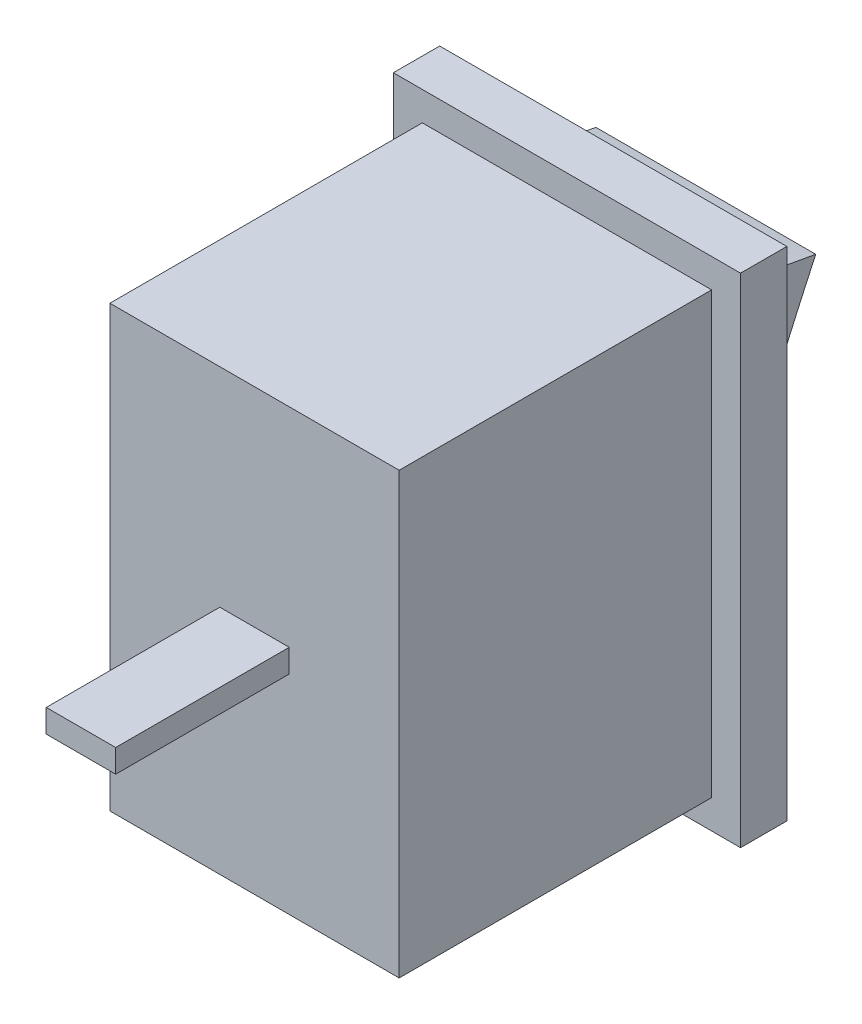
ISO-10303-21;
HEADER;
FILE_DESCRIPTION(('STEP AP214'),'2;1');
FILE_NAME('part.step','',(''),(''),'','','');
FILE_SCHEMA(('AUTOMOTIVE_DESIGN { 1 0 10303 214 1 1 1 1 }'));
ENDSEC;
DATA;
#1=APPLICATION_CONTEXT('core data for automotive mechanical design processes');
#2=APPLICATION_PROTOCOL_DEFINITION('international standard','automotive_design',2000,#1);
#3=PRODUCT_CONTEXT('',#1,'mechanical');
#4=PRODUCT('Part','Part','',(#3));
#5=PRODUCT_RELATED_PRODUCT_CATEGORY('part','',(#4));
#6=PRODUCT_DEFINITION_FORMATION('','',#4);
#7=PRODUCT_DEFINITION_CONTEXT('part definition',#1,'design');
#8=PRODUCT_DEFINITION('design','',#6,#7);
#9=PRODUCT_DEFINITION_SHAPE('','',#8);
#10=(LENGTH_UNIT() NAMED_UNIT(*) SI_UNIT(.MILLI.,.METRE.));
#11=(NAMED_UNIT(*) PLANE_ANGLE_UNIT() SI_UNIT($,.RADIAN.));
#12=(NAMED_UNIT(*) SI_UNIT($,.STERADIAN.) SOLID_ANGLE_UNIT());
#13=UNCERTAINTY_MEASURE_WITH_UNIT(LENGTH_MEASURE(1.E-05),#10,'distance_accuracy_value','');
#14=(GEOMETRIC_REPRESENTATION_CONTEXT(3) GLOBAL_UNCERTAINTY_ASSIGNED_CONTEXT((#13)) GLOBAL_UNIT_ASSIGNED_CONTEXT((#10,
#11,#12)) REPRESENTATION_CONTEXT('',''));
#15=CARTESIAN_POINT('',(0.,0.,0.));
#16=DIRECTION('',(0.,0.,1.));
#17=DIRECTION('',(1.,0.,0.));
#18=AXIS2_PLACEMENT_3D('',#15,#16,#17);
#19=CARTESIAN_POINT('',(-6.25,-9.5,15.5));
#20=DIRECTION('',(0.,0.,1.));
#21=DIRECTION('',(1.,0.,0.));
#22=AXIS2_PLACEMENT_3D('',#19,#20,#21);
#23=PLANE('',#22);
#24=DIRECTION('',(0.,-1.,0.));
#25=VECTOR('',#24,1.);
#26=CARTESIAN_POINT('',(-6.25,-9.5,15.5));
#27=LINE('',#26,#25);
#28=CARTESIAN_POINT('',(-6.25,9.5,15.5));
#29=VERTEX_POINT('',#28);
#30=CARTESIAN_POINT('',(-6.25,-9.5,15.5));
#31=VERTEX_POINT('',#30);
#32=EDGE_CURVE('E304',#29,#31,#27,.T.);
#33=ORIENTED_EDGE('',*,*,#32,.T.);
#34=DIRECTION('',(1.,0.,0.));
#35=VECTOR('',#34,1.);
#36=CARTESIAN_POINT('',(6.25000000000001,-9.5,15.5));
#37=LINE('',#36,#35);
#38=CARTESIAN_POINT('',(6.25000000000001,-9.5,15.5));
#39=VERTEX_POINT('',#38);
#40=EDGE_CURVE('E317',#31,#39,#37,.T.);
#41=ORIENTED_EDGE('',*,*,#40,.T.);
#42=DIRECTION('',(0.,1.,0.));
#43=VECTOR('',#42,1.);
#44=CARTESIAN_POINT('',(6.25,9.5,15.5));
#45=LINE('',#44,#43);
#46=CARTESIAN_POINT('',(6.25,9.5,15.5));
#47=VERTEX_POINT('',#46);
#48=EDGE_CURVE('E315',#39,#47,#45,.T.);
#49=ORIENTED_EDGE('',*,*,#48,.T.);
#50=DIRECTION('',(-1.,0.,0.));
#51=VECTOR('',#50,1.);
#52=CARTESIAN_POINT('',(-6.25,9.5,15.5));
#53=LINE('',#52,#51);
#54=EDGE_CURVE('E301',#47,#29,#53,.T.);
#55=ORIENTED_EDGE('',*,*,#54,.T.);
#56=EDGE_LOOP('',(#33,#41,#49,#55));
#57=FACE_BOUND('',#56,.T.);
#58=DIRECTION('',(1.,0.,0.));
#59=VECTOR('',#58,1.);
#60=CARTESIAN_POINT('',(-1.5,-0.5,15.5));
#61=LINE('',#60,#59);
#62=CARTESIAN_POINT('',(-1.5,-0.5,15.5));
#63=VERTEX_POINT('',#62);
#64=CARTESIAN_POINT('',(1.5,-0.5,15.5));
#65=VERTEX_POINT('',#64);
#66=EDGE_CURVE('E384',#63,#65,#61,.T.);
#67=ORIENTED_EDGE('',*,*,#66,.F.);
#68=DIRECTION('',(0.,-1.,0.));
#69=VECTOR('',#68,1.);
#70=CARTESIAN_POINT('',(-1.5,0.5,15.5));
#71=LINE('',#70,#69);
#72=CARTESIAN_POINT('',(-1.5,0.5,15.5));
#73=VERTEX_POINT('',#72);
#74=EDGE_CURVE('E170',#73,#63,#71,.T.);
#75=ORIENTED_EDGE('',*,*,#74,.F.);
#76=DIRECTION('',(-1.,0.,0.));
#77=VECTOR('',#76,1.);
#78=CARTESIAN_POINT('',(-1.5,0.5,15.5));
#79=LINE('',#78,#77);
#80=CARTESIAN_POINT('',(1.5,0.500000000000001,15.5));
#81=VERTEX_POINT('',#80);
#82=EDGE_CURVE('E166',#81,#73,#79,.T.);
#83=ORIENTED_EDGE('',*,*,#82,.F.);
#84=DIRECTION('',(0.,1.,0.));
#85=VECTOR('',#84,1.);
#86=CARTESIAN_POINT('',(1.5,0.5,15.5));
#87=LINE('',#86,#85);
#88=EDGE_CURVE('E386',#65,#81,#87,.T.);
#89=ORIENTED_EDGE('',*,*,#88,.F.);
#90=EDGE_LOOP('',(#67,#75,#83,#89));
#91=FACE_BOUND('',#90,.T.);
#92=ADVANCED_FACE('F33',(#57,#91),#23,.T.);
#93=CARTESIAN_POINT('',(4.75,7.5,-4.));
#94=DIRECTION('',(-1.,0.,0.));
#95=DIRECTION('',(0.,-1.,0.));
#96=AXIS2_PLACEMENT_3D('',#93,#94,#95);
#97=PLANE('',#96);
#98=CARTESIAN_POINT('',(4.75,-7.5,-0.355698538172021));
#99=CARTESIAN_POINT('',(4.75,-7.20358473254136,-0.354349181532763));
#100=CARTESIAN_POINT('',(4.75,-4.68700606925858,-0.342893084292468));
#101=CARTESIAN_POINT('',(4.75,0.423075598671808,-0.90591646987989));
#102=CARTESIAN_POINT('',(4.75,4.76511014941746,-2.92374207641146));
#103=CARTESIAN_POINT('',(4.75,7.08104323828726,-4.));
#104=B_SPLINE_CURVE_WITH_KNOTS('',3,(#98,#99,#100,#101,#102,#103),.UNSPECIFIED.,.F.,.F.,(4,1,1,
4),(0.,0.0586457613073711,0.497905093969898,1.),.UNSPECIFIED.);
#105=CARTESIAN_POINT('',(4.75,7.08104323828726,-4.));
#106=VERTEX_POINT('',#105);
#107=CARTESIAN_POINT('',(4.74999999999999,-7.5,-0.355698538172021));
#108=VERTEX_POINT('',#107);
#109=EDGE_CURVE('E336',#106,#108,#104,.F.);
#110=ORIENTED_EDGE('',*,*,#109,.F.);
#111=CARTESIAN_POINT('',(4.75,7.08104323828726,-4.));
#112=CARTESIAN_POINT('',(4.75,7.19501669015073,-3.41831864187691));
#113=CARTESIAN_POINT('',(4.75,7.45366483827933,-2.09826731747113));
#114=CARTESIAN_POINT('',(4.75,7.48337925673809,-0.75266301192165));
#115=CARTESIAN_POINT('',(4.75,7.5,0.));
#116=B_SPLINE_CURVE_WITH_KNOTS('',3,(#111,#112,#113,#114,#115),.UNSPECIFIED.,.F.,.F.,(4,1,4),
(0.,0.440650562117295,1.),.UNSPECIFIED.);
#117=CARTESIAN_POINT('',(4.75,7.5,0.));
#118=VERTEX_POINT('',#117);
#119=EDGE_CURVE('E349',#118,#106,#116,.F.);
#120=ORIENTED_EDGE('',*,*,#119,.F.);
#121=DIRECTION('',(0.,-1.,0.));
#122=VECTOR('',#121,1.);
#123=CARTESIAN_POINT('',(4.75,7.5,0.));
#124=LINE('',#123,#122);
#125=CARTESIAN_POINT('',(4.74999999999999,-7.5,0.));
#126=VERTEX_POINT('',#125);
#127=EDGE_CURVE('E333',#118,#126,#124,.T.);
#128=ORIENTED_EDGE('',*,*,#127,.T.);
#129=DIRECTION('',(0.,0.,1.));
#130=VECTOR('',#129,1.);
#131=CARTESIAN_POINT('',(4.74999999999999,-7.5,-4.));
#132=LINE('',#131,#130);
#133=EDGE_CURVE('E313',#108,#126,#132,.T.);
#134=ORIENTED_EDGE('',*,*,#133,.F.);
#135=EDGE_LOOP('',(#110,#120,#128,#134));
#136=FACE_BOUND('',#135,.T.);
#137=ADVANCED_FACE('F210',(#136),#97,.F.);
#138=CARTESIAN_POINT('',(4.74999999999999,-7.5,-4.));
#139=DIRECTION('',(0.,1.,0.));
#140=DIRECTION('',(-1.,0.,0.));
#141=AXIS2_PLACEMENT_3D('',#138,#139,#140);
#142=PLANE('',#141);
#143=DIRECTION('',(1.,0.,0.));
#144=VECTOR('',#143,1.);
#145=CARTESIAN_POINT('',(-49.0282731317614,-7.49999999999999,-0.355698538172021));
#146=LINE('',#145,#144);
#147=CARTESIAN_POINT('',(-4.75,-7.5,-0.355698538172021));
#148=VERTEX_POINT('',#147);
#149=EDGE_CURVE('E56',#148,#108,#146,.T.);
#150=ORIENTED_EDGE('',*,*,#149,.T.);
#151=ORIENTED_EDGE('',*,*,#133,.T.);
#152=DIRECTION('',(-1.,0.,0.));
#153=VECTOR('',#152,1.);
#154=CARTESIAN_POINT('',(4.74999999999999,-7.5,0.));
#155=LINE('',#154,#153);
#156=CARTESIAN_POINT('',(-4.75,-7.5,0.));
#157=VERTEX_POINT('',#156);
#158=EDGE_CURVE('E330',#126,#157,#155,.T.);
#159=ORIENTED_EDGE('',*,*,#158,.T.);
#160=DIRECTION('',(0.,0.,1.));
#161=VECTOR('',#160,1.);
#162=CARTESIAN_POINT('',(-4.75,-7.5,-4.));
#163=LINE('',#162,#161);
#164=EDGE_CURVE('E322',#148,#157,#163,.T.);
#165=ORIENTED_EDGE('',*,*,#164,.F.);
#166=EDGE_LOOP('',(#150,#151,#159,#165));
#167=FACE_BOUND('',#166,.T.);
#168=ADVANCED_FACE('F206',(#167),#142,.F.);
#169=CARTESIAN_POINT('',(-4.75,7.5,-4.));
#170=DIRECTION('',(1.,0.,0.));
#171=DIRECTION('',(0.,1.,0.));
#172=AXIS2_PLACEMENT_3D('',#169,#170,#171);
#173=PLANE('',#172);
#174=CARTESIAN_POINT('',(-4.75,-7.5,-0.355698538172021));
#175=CARTESIAN_POINT('',(-4.75,-7.20358473254136,-0.354349181532763));
#176=CARTESIAN_POINT('',(-4.75,-4.68700606925858,-0.342893084292468));
#177=CARTESIAN_POINT('',(-4.75,0.423075598671809,-0.90591646987989));
#178=CARTESIAN_POINT('',(-4.75,4.76511014941746,-2.92374207641146));
#179=CARTESIAN_POINT('',(-4.75,7.08104323828726,-4.));
#180=B_SPLINE_CURVE_WITH_KNOTS('',3,(#174,#175,#176,#177,#178,#179),.UNSPECIFIED.,.F.,.F.,(4,1,
1,4),(0.,0.0586457613073711,0.497905093969898,1.),.UNSPECIFIED.);
#181=CARTESIAN_POINT('',(-4.75,7.08104323828726,-4.));
#182=VERTEX_POINT('',#181);
#183=EDGE_CURVE('E341',#148,#182,#180,.T.);
#184=ORIENTED_EDGE('',*,*,#183,.F.);
#185=ORIENTED_EDGE('',*,*,#164,.T.);
#186=DIRECTION('',(0.,1.,0.));
#187=VECTOR('',#186,1.);
#188=CARTESIAN_POINT('',(-4.75,7.5,0.));
#189=LINE('',#188,#187);
#190=CARTESIAN_POINT('',(-4.75,7.5,0.));
#191=VERTEX_POINT('',#190);
#192=EDGE_CURVE('E327',#157,#191,#189,.T.);
#193=ORIENTED_EDGE('',*,*,#192,.T.);
#194=CARTESIAN_POINT('',(-4.75,7.08104323828726,-4.));
#195=CARTESIAN_POINT('',(-4.75,7.19501669015073,-3.41831864187691));
#196=CARTESIAN_POINT('',(-4.75,7.45366483827933,-2.09826731747113));
#197=CARTESIAN_POINT('',(-4.75,7.48337925673809,-0.75266301192165));
#198=CARTESIAN_POINT('',(-4.75,7.5,0.));
#199=B_SPLINE_CURVE_WITH_KNOTS('',3,(#194,#195,#196,#197,#198),.UNSPECIFIED.,.F.,.F.,(4,1,4),
(0.,0.440650562117295,1.),.UNSPECIFIED.);
#200=EDGE_CURVE('E357',#182,#191,#199,.T.);
#201=ORIENTED_EDGE('',*,*,#200,.F.);
#202=EDGE_LOOP('',(#184,#185,#193,#201));
#203=FACE_BOUND('',#202,.T.);
#204=ADVANCED_FACE('F202',(#203),#173,.F.);
#205=CARTESIAN_POINT('',(-7.5,-10.75,0.));
#206=DIRECTION('',(0.,0.,1.));
#207=DIRECTION('',(1.,0.,0.));
#208=AXIS2_PLACEMENT_3D('',#205,#206,#207);
#209=PLANE('',#208);
#210=ORIENTED_EDGE('',*,*,#127,.F.);
#211=DIRECTION('',(1.,0.,0.));
#212=VECTOR('',#211,1.);
#213=CARTESIAN_POINT('',(4.75,7.5,0.));
#214=LINE('',#213,#212);
#215=EDGE_CURVE('E324',#191,#118,#214,.T.);
#216=ORIENTED_EDGE('',*,*,#215,.F.);
#217=ORIENTED_EDGE('',*,*,#192,.F.);
#218=ORIENTED_EDGE('',*,*,#158,.F.);
#219=EDGE_LOOP('',(#210,#216,#217,#218));
#220=FACE_BOUND('',#219,.T.);
#221=DIRECTION('',(-1.,0.,0.));
#222=VECTOR('',#221,1.);
#223=CARTESIAN_POINT('',(-7.5,10.75,0.));
#224=LINE('',#223,#222);
#225=CARTESIAN_POINT('',(7.5,10.75,0.));
#226=VERTEX_POINT('',#225);
#227=CARTESIAN_POINT('',(-7.5,10.75,0.));
#228=VERTEX_POINT('',#227);
#229=EDGE_CURVE('E270',#226,#228,#224,.T.);
#230=ORIENTED_EDGE('',*,*,#229,.F.);
#231=DIRECTION('',(0.,1.,0.));
#232=VECTOR('',#231,1.);
#233=CARTESIAN_POINT('',(7.5,10.75,0.));
#234=LINE('',#233,#232);
#235=CARTESIAN_POINT('',(7.50000000000002,-10.75,0.));
#236=VERTEX_POINT('',#235);
#237=EDGE_CURVE('E262',#236,#226,#234,.T.);
#238=ORIENTED_EDGE('',*,*,#237,.F.);
#239=DIRECTION('',(1.,0.,0.));
#240=VECTOR('',#239,1.);
#241=CARTESIAN_POINT('',(7.50000000000002,-10.75,0.));
#242=LINE('',#241,#240);
#243=CARTESIAN_POINT('',(-7.5,-10.75,0.));
#244=VERTEX_POINT('',#243);
#245=EDGE_CURVE('E255',#244,#236,#242,.T.);
#246=ORIENTED_EDGE('',*,*,#245,.F.);
#247=DIRECTION('',(0.,-1.,0.));
#248=VECTOR('',#247,1.);
#249=CARTESIAN_POINT('',(-7.5,-10.75,0.));
#250=LINE('',#249,#248);
#251=EDGE_CURVE('E263',#228,#244,#250,.T.);
#252=ORIENTED_EDGE('',*,*,#251,.F.);
#253=EDGE_LOOP('',(#230,#238,#246,#252));
#254=FACE_BOUND('',#253,.T.);
#255=ADVANCED_FACE('F205',(#220,#254),#209,.F.);
#256=CARTESIAN_POINT('',(-7.5,-10.75,2.));
#257=DIRECTION('',(0.,0.,1.));
#258=DIRECTION('',(1.,0.,0.));
#259=AXIS2_PLACEMENT_3D('',#256,#257,#258);
#260=PLANE('',#259);
#261=DIRECTION('',(0.,-1.,0.));
#262=VECTOR('',#261,1.);
#263=CARTESIAN_POINT('',(-7.5,-10.75,2.));
#264=LINE('',#263,#262);
#265=CARTESIAN_POINT('',(-7.5,10.75,2.));
#266=VERTEX_POINT('',#265);
#267=CARTESIAN_POINT('',(-7.5,-10.75,2.));
#268=VERTEX_POINT('',#267);
#269=EDGE_CURVE('E272',#266,#268,#264,.T.);
#270=ORIENTED_EDGE('',*,*,#269,.T.);
#271=DIRECTION('',(1.,0.,0.));
#272=VECTOR('',#271,1.);
#273=CARTESIAN_POINT('',(7.50000000000002,-10.75,2.));
#274=LINE('',#273,#272);
#275=CARTESIAN_POINT('',(7.50000000000002,-10.75,2.));
#276=VERTEX_POINT('',#275);
#277=EDGE_CURVE('E278',#268,#276,#274,.T.);
#278=ORIENTED_EDGE('',*,*,#277,.T.);
#279=DIRECTION('',(0.,1.,0.));
#280=VECTOR('',#279,1.);
#281=CARTESIAN_POINT('',(7.5,10.75,2.));
#282=LINE('',#281,#280);
#283=CARTESIAN_POINT('',(7.5,10.75,2.));
#284=VERTEX_POINT('',#283);
#285=EDGE_CURVE('E267',#276,#284,#282,.T.);
#286=ORIENTED_EDGE('',*,*,#285,.T.);
#287=DIRECTION('',(-1.,0.,0.));
#288=VECTOR('',#287,1.);
#289=CARTESIAN_POINT('',(-7.5,10.75,2.));
#290=LINE('',#289,#288);
#291=EDGE_CURVE('E281',#284,#266,#290,.T.);
#292=ORIENTED_EDGE('',*,*,#291,.T.);
#293=EDGE_LOOP('',(#270,#278,#286,#292));
#294=FACE_BOUND('',#293,.T.);
#295=DIRECTION('',(1.,0.,0.));
#296=VECTOR('',#295,1.);
#297=CARTESIAN_POINT('',(6.25000000000001,-9.5,2.));
#298=LINE('',#297,#296);
#299=CARTESIAN_POINT('',(-6.25,-9.5,2.));
#300=VERTEX_POINT('',#299);
#301=CARTESIAN_POINT('',(6.25000000000001,-9.5,2.));
#302=VERTEX_POINT('',#301);
#303=EDGE_CURVE('E308',#300,#302,#298,.T.);
#304=ORIENTED_EDGE('',*,*,#303,.F.);
#305=DIRECTION('',(0.,-1.,0.));
#306=VECTOR('',#305,1.);
#307=CARTESIAN_POINT('',(-6.25,-9.5,2.));
#308=LINE('',#307,#306);
#309=CARTESIAN_POINT('',(-6.25,9.5,2.));
#310=VERTEX_POINT('',#309);
#311=EDGE_CURVE('E310',#310,#300,#308,.T.);
#312=ORIENTED_EDGE('',*,*,#311,.F.);
#313=DIRECTION('',(-1.,0.,0.));
#314=VECTOR('',#313,1.);
#315=CARTESIAN_POINT('',(-6.25,9.5,2.));
#316=LINE('',#315,#314);
#317=CARTESIAN_POINT('',(6.25,9.5,2.));
#318=VERTEX_POINT('',#317);
#319=EDGE_CURVE('E302',#318,#310,#316,.T.);
#320=ORIENTED_EDGE('',*,*,#319,.F.);
#321=DIRECTION('',(0.,1.,0.));
#322=VECTOR('',#321,1.);
#323=CARTESIAN_POINT('',(6.25,9.5,2.));
#324=LINE('',#323,#322);
#325=EDGE_CURVE('E305',#302,#318,#324,.T.);
#326=ORIENTED_EDGE('',*,*,#325,.F.);
#327=EDGE_LOOP('',(#304,#312,#320,#326));
#328=FACE_BOUND('',#327,.T.);
#329=ADVANCED_FACE('F235',(#294,#328),#260,.T.);
#330=CARTESIAN_POINT('',(-7.5,-10.75,2.));
#331=DIRECTION('',(1.,0.,0.));
#332=DIRECTION('',(0.,1.,0.));
#333=AXIS2_PLACEMENT_3D('',#330,#331,#332);
#334=PLANE('',#333);
#335=ORIENTED_EDGE('',*,*,#251,.T.);
#336=DIRECTION('',(0.,0.,-1.));
#337=VECTOR('',#336,1.);
#338=CARTESIAN_POINT('',(-7.5,-10.75,2.));
#339=LINE('',#338,#337);
#340=EDGE_CURVE('E11',#268,#244,#339,.T.);
#341=ORIENTED_EDGE('',*,*,#340,.F.);
#342=ORIENTED_EDGE('',*,*,#269,.F.);
#343=DIRECTION('',(0.,0.,-1.));
#344=VECTOR('',#343,1.);
#345=CARTESIAN_POINT('',(-7.5,10.75,2.));
#346=LINE('',#345,#344);
#347=EDGE_CURVE('E283',#266,#228,#346,.T.);
#348=ORIENTED_EDGE('',*,*,#347,.T.);
#349=EDGE_LOOP('',(#335,#341,#342,#348));
#350=FACE_BOUND('',#349,.T.);
#351=ADVANCED_FACE('F35',(#350),#334,.F.);
#352=CARTESIAN_POINT('',(7.50000000000002,-10.75,2.));
#353=DIRECTION('',(0.,1.,0.));
#354=DIRECTION('',(-1.,0.,0.));
#355=AXIS2_PLACEMENT_3D('',#352,#353,#354);
#356=PLANE('',#355);
#357=ORIENTED_EDGE('',*,*,#245,.T.);
#358=DIRECTION('',(0.,0.,-1.));
#359=VECTOR('',#358,1.);
#360=CARTESIAN_POINT('',(7.50000000000002,-10.75,2.));
#361=LINE('',#360,#359);
#362=EDGE_CURVE('E41',#276,#236,#361,.T.);
#363=ORIENTED_EDGE('',*,*,#362,.F.);
#364=ORIENTED_EDGE('',*,*,#277,.F.);
#365=ORIENTED_EDGE('',*,*,#340,.T.);
#366=EDGE_LOOP('',(#357,#363,#364,#365));
#367=FACE_BOUND('',#366,.T.);
#368=ADVANCED_FACE('F245',(#367),#356,.F.);
#369=CARTESIAN_POINT('',(7.5,10.75,2.));
#370=DIRECTION('',(-1.,0.,0.));
#371=DIRECTION('',(0.,-1.,0.));
#372=AXIS2_PLACEMENT_3D('',#369,#370,#371);
#373=PLANE('',#372);
#374=ORIENTED_EDGE('',*,*,#237,.T.);
#375=DIRECTION('',(0.,0.,-1.));
#376=VECTOR('',#375,1.);
#377=CARTESIAN_POINT('',(7.5,10.75,2.));
#378=LINE('',#377,#376);
#379=EDGE_CURVE('E268',#284,#226,#378,.T.);
#380=ORIENTED_EDGE('',*,*,#379,.F.);
#381=ORIENTED_EDGE('',*,*,#285,.F.);
#382=ORIENTED_EDGE('',*,*,#362,.T.);
#383=EDGE_LOOP('',(#374,#380,#381,#382));
#384=FACE_BOUND('',#383,.T.);
#385=ADVANCED_FACE('F242',(#384),#373,.F.);
#386=CARTESIAN_POINT('',(-7.5,10.75,2.));
#387=DIRECTION('',(0.,-1.,0.));
#388=DIRECTION('',(1.,0.,0.));
#389=AXIS2_PLACEMENT_3D('',#386,#387,#388);
#390=PLANE('',#389);
#391=ORIENTED_EDGE('',*,*,#229,.T.);
#392=ORIENTED_EDGE('',*,*,#347,.F.);
#393=ORIENTED_EDGE('',*,*,#291,.F.);
#394=ORIENTED_EDGE('',*,*,#379,.T.);
#395=EDGE_LOOP('',(#391,#392,#393,#394));
#396=FACE_BOUND('',#395,.T.);
#397=ADVANCED_FACE('F231',(#396),#390,.F.);
#398=CARTESIAN_POINT('',(-6.25,-9.5,15.5));
#399=DIRECTION('',(1.,0.,0.));
#400=DIRECTION('',(0.,1.,0.));
#401=AXIS2_PLACEMENT_3D('',#398,#399,#400);
#402=PLANE('',#401);
#403=ORIENTED_EDGE('',*,*,#311,.T.);
#404=DIRECTION('',(0.,0.,-1.));
#405=VECTOR('',#404,1.);
#406=CARTESIAN_POINT('',(-6.25,-9.5,15.5));
#407=LINE('',#406,#405);
#408=EDGE_CURVE('E290',#31,#300,#407,.T.);
#409=ORIENTED_EDGE('',*,*,#408,.F.);
#410=ORIENTED_EDGE('',*,*,#32,.F.);
#411=DIRECTION('',(0.,0.,-1.));
#412=VECTOR('',#411,1.);
#413=CARTESIAN_POINT('',(-6.25,9.5,15.5));
#414=LINE('',#413,#412);
#415=EDGE_CURVE('E298',#29,#310,#414,.T.);
#416=ORIENTED_EDGE('',*,*,#415,.T.);
#417=EDGE_LOOP('',(#403,#409,#410,#416));
#418=FACE_BOUND('',#417,.T.);
#419=ADVANCED_FACE('F227',(#418),#402,.F.);
#420=CARTESIAN_POINT('',(6.25000000000001,-9.5,15.5));
#421=DIRECTION('',(0.,1.,0.));
#422=DIRECTION('',(-1.,0.,0.));
#423=AXIS2_PLACEMENT_3D('',#420,#421,#422);
#424=PLANE('',#423);
#425=ORIENTED_EDGE('',*,*,#303,.T.);
#426=DIRECTION('',(0.,0.,-1.));
#427=VECTOR('',#426,1.);
#428=CARTESIAN_POINT('',(6.25000000000001,-9.5,15.5));
#429=LINE('',#428,#427);
#430=EDGE_CURVE('E291',#39,#302,#429,.T.);
#431=ORIENTED_EDGE('',*,*,#430,.F.);
#432=ORIENTED_EDGE('',*,*,#40,.F.);
#433=ORIENTED_EDGE('',*,*,#408,.T.);
#434=EDGE_LOOP('',(#425,#431,#432,#433));
#435=FACE_BOUND('',#434,.T.);
#436=ADVANCED_FACE('F223',(#435),#424,.F.);
#437=CARTESIAN_POINT('',(6.25,9.5,15.5));
#438=DIRECTION('',(-1.,0.,0.));
#439=DIRECTION('',(0.,-1.,0.));
#440=AXIS2_PLACEMENT_3D('',#437,#438,#439);
#441=PLANE('',#440);
#442=ORIENTED_EDGE('',*,*,#325,.T.);
#443=DIRECTION('',(0.,0.,-1.));
#444=VECTOR('',#443,1.);
#445=CARTESIAN_POINT('',(6.25,9.5,15.5));
#446=LINE('',#445,#444);
#447=EDGE_CURVE('E296',#47,#318,#446,.T.);
#448=ORIENTED_EDGE('',*,*,#447,.F.);
#449=ORIENTED_EDGE('',*,*,#48,.F.);
#450=ORIENTED_EDGE('',*,*,#430,.T.);
#451=EDGE_LOOP('',(#442,#448,#449,#450));
#452=FACE_BOUND('',#451,.T.);
#453=ADVANCED_FACE('F219',(#452),#441,.F.);
#454=CARTESIAN_POINT('',(-6.25,9.5,15.5));
#455=DIRECTION('',(0.,-1.,0.));
#456=DIRECTION('',(1.,0.,0.));
#457=AXIS2_PLACEMENT_3D('',#454,#455,#456);
#458=PLANE('',#457);
#459=ORIENTED_EDGE('',*,*,#319,.T.);
#460=ORIENTED_EDGE('',*,*,#415,.F.);
#461=ORIENTED_EDGE('',*,*,#54,.F.);
#462=ORIENTED_EDGE('',*,*,#447,.T.);
#463=EDGE_LOOP('',(#459,#460,#461,#462));
#464=FACE_BOUND('',#463,.T.);
#465=ADVANCED_FACE('F200',(#464),#458,.F.);
#466=CARTESIAN_POINT('',(-49.0282731317614,-7.49999999999999,-0.355698538172021));
#467=CARTESIAN_POINT('',(-49.0282731317614,-7.20358473254136,-0.354349181532763));
#468=CARTESIAN_POINT('',(-49.0282731317614,-4.68700606925858,-0.342893084292468));
#469=CARTESIAN_POINT('',(-49.0282731317614,0.423075598671814,-0.90591646987989));
#470=CARTESIAN_POINT('',(-49.0282731317614,4.76511014941747,-2.92374207641146));
#471=CARTESIAN_POINT('',(-49.0282731317614,7.08104323828727,-4.));
#472=B_SPLINE_CURVE_WITH_KNOTS('',3,(#466,#467,#468,#469,#470,#471),.UNSPECIFIED.,.F.,.F.,(4,1,
1,4),(0.,0.0586457613073711,0.497905093969898,1.),.UNSPECIFIED.);
#473=DIRECTION('',(1.,0.,0.));
#474=VECTOR('',#473,1.);
#475=SURFACE_OF_LINEAR_EXTRUSION('',#472,#474);
#476=DIRECTION('',(1.,0.,0.));
#477=VECTOR('',#476,1.);
#478=CARTESIAN_POINT('',(-49.0282731317614,7.08104323828727,-4.));
#479=LINE('',#478,#477);
#480=EDGE_CURVE('E172',#182,#106,#479,.T.);
#481=ORIENTED_EDGE('',*,*,#480,.T.);
#482=ORIENTED_EDGE('',*,*,#109,.T.);
#483=ORIENTED_EDGE('',*,*,#149,.F.);
#484=ORIENTED_EDGE('',*,*,#183,.T.);
#485=EDGE_LOOP('',(#481,#482,#483,#484));
#486=FACE_BOUND('',#485,.T.);
#487=ADVANCED_FACE('F195',(#486),#475,.T.);
#488=CARTESIAN_POINT('',(-49.0282731317614,7.08104323828727,-4.));
#489=CARTESIAN_POINT('',(-49.0282731317614,7.19501669015073,-3.41831864187691));
#490=CARTESIAN_POINT('',(-49.0282731317614,7.45366483827934,-2.09826731747113));
#491=CARTESIAN_POINT('',(-49.0282731317614,7.48337925673809,-0.75266301192165));
#492=CARTESIAN_POINT('',(-49.0282731317614,7.50000000000001,0.));
#493=B_SPLINE_CURVE_WITH_KNOTS('',3,(#488,#489,#490,#491,#492),.UNSPECIFIED.,.F.,.F.,(4,1,4),
(0.,0.440650562117295,1.),.UNSPECIFIED.);
#494=DIRECTION('',(1.,0.,0.));
#495=VECTOR('',#494,1.);
#496=SURFACE_OF_LINEAR_EXTRUSION('',#493,#495);
#497=ORIENTED_EDGE('',*,*,#215,.T.);
#498=ORIENTED_EDGE('',*,*,#119,.T.);
#499=ORIENTED_EDGE('',*,*,#480,.F.);
#500=ORIENTED_EDGE('',*,*,#200,.T.);
#501=EDGE_LOOP('',(#497,#498,#499,#500));
#502=FACE_BOUND('',#501,.T.);
#503=ADVANCED_FACE('F191',(#502),#496,.T.);
#504=CARTESIAN_POINT('',(-1.5,0.5,23.));
#505=DIRECTION('',(1.,0.,0.));
#506=DIRECTION('',(0.,0.,-1.));
#507=AXIS2_PLACEMENT_3D('',#504,#505,#506);
#508=PLANE('',#507);
#509=ORIENTED_EDGE('',*,*,#74,.T.);
#510=DIRECTION('',(0.,0.,-1.));
#511=VECTOR('',#510,1.);
#512=CARTESIAN_POINT('',(-1.5,-0.5,23.));
#513=LINE('',#512,#511);
#514=CARTESIAN_POINT('',(-1.5,-0.5,23.));
#515=VERTEX_POINT('',#514);
#516=EDGE_CURVE('E151',#515,#63,#513,.T.);
#517=ORIENTED_EDGE('',*,*,#516,.F.);
#518=DIRECTION('',(0.,-1.,0.));
#519=VECTOR('',#518,1.);
#520=CARTESIAN_POINT('',(-1.5,0.5,23.));
#521=LINE('',#520,#519);
#522=CARTESIAN_POINT('',(-1.5,0.5,23.));
#523=VERTEX_POINT('',#522);
#524=EDGE_CURVE('E158',#523,#515,#521,.T.);
#525=ORIENTED_EDGE('',*,*,#524,.F.);
#526=DIRECTION('',(0.,0.,-1.));
#527=VECTOR('',#526,1.);
#528=CARTESIAN_POINT('',(-1.5,0.5,23.));
#529=LINE('',#528,#527);
#530=EDGE_CURVE('E393',#523,#73,#529,.T.);
#531=ORIENTED_EDGE('',*,*,#530,.T.);
#532=EDGE_LOOP('',(#509,#517,#525,#531));
#533=FACE_BOUND('',#532,.T.);
#534=ADVANCED_FACE('F168',(#533),#508,.F.);
#535=CARTESIAN_POINT('',(-1.5,-0.5,23.));
#536=DIRECTION('',(0.,1.,0.));
#537=DIRECTION('',(-1.,0.,0.));
#538=AXIS2_PLACEMENT_3D('',#535,#536,#537);
#539=PLANE('',#538);
#540=ORIENTED_EDGE('',*,*,#66,.T.);
#541=DIRECTION('',(0.,0.,-1.));
#542=VECTOR('',#541,1.);
#543=CARTESIAN_POINT('',(1.5,-0.5,23.));
#544=LINE('',#543,#542);
#545=CARTESIAN_POINT('',(1.5,-0.5,23.));
#546=VERTEX_POINT('',#545);
#547=EDGE_CURVE('E154',#546,#65,#544,.T.);
#548=ORIENTED_EDGE('',*,*,#547,.F.);
#549=DIRECTION('',(1.,0.,0.));
#550=VECTOR('',#549,1.);
#551=CARTESIAN_POINT('',(-1.5,-0.5,23.));
#552=LINE('',#551,#550);
#553=EDGE_CURVE('E147',#515,#546,#552,.T.);
#554=ORIENTED_EDGE('',*,*,#553,.F.);
#555=ORIENTED_EDGE('',*,*,#516,.T.);
#556=EDGE_LOOP('',(#540,#548,#554,#555));
#557=FACE_BOUND('',#556,.T.);
#558=ADVANCED_FACE('F149',(#557),#539,.F.);
#559=CARTESIAN_POINT('',(1.5,0.5,23.));
#560=DIRECTION('',(-1.,0.,0.));
#561=DIRECTION('',(0.,-1.,0.));
#562=AXIS2_PLACEMENT_3D('',#559,#560,#561);
#563=PLANE('',#562);
#564=ORIENTED_EDGE('',*,*,#88,.T.);
#565=DIRECTION('',(0.,0.,-1.));
#566=VECTOR('',#565,1.);
#567=CARTESIAN_POINT('',(1.5,0.5,23.));
#568=LINE('',#567,#566);
#569=CARTESIAN_POINT('',(1.5,0.5,23.));
#570=VERTEX_POINT('',#569);
#571=EDGE_CURVE('E48',#570,#81,#568,.T.);
#572=ORIENTED_EDGE('',*,*,#571,.F.);
#573=DIRECTION('',(0.,1.,0.));
#574=VECTOR('',#573,1.);
#575=CARTESIAN_POINT('',(1.5,0.5,23.));
#576=LINE('',#575,#574);
#577=EDGE_CURVE('E157',#546,#570,#576,.T.);
#578=ORIENTED_EDGE('',*,*,#577,.F.);
#579=ORIENTED_EDGE('',*,*,#547,.T.);
#580=EDGE_LOOP('',(#564,#572,#578,#579));
#581=FACE_BOUND('',#580,.T.);
#582=ADVANCED_FACE('F396',(#581),#563,.F.);
#583=CARTESIAN_POINT('',(-1.5,0.5,23.));
#584=DIRECTION('',(0.,-1.,0.));
#585=DIRECTION('',(1.,0.,0.));
#586=AXIS2_PLACEMENT_3D('',#583,#584,#585);
#587=PLANE('',#586);
#588=ORIENTED_EDGE('',*,*,#82,.T.);
#589=ORIENTED_EDGE('',*,*,#530,.F.);
#590=DIRECTION('',(-1.,0.,0.));
#591=VECTOR('',#590,1.);
#592=CARTESIAN_POINT('',(-1.5,0.5,23.));
#593=LINE('',#592,#591);
#594=EDGE_CURVE('E162',#570,#523,#593,.T.);
#595=ORIENTED_EDGE('',*,*,#594,.F.);
#596=ORIENTED_EDGE('',*,*,#571,.T.);
#597=EDGE_LOOP('',(#588,#589,#595,#596));
#598=FACE_BOUND('',#597,.T.);
#599=ADVANCED_FACE('F397',(#598),#587,.F.);
#600=CARTESIAN_POINT('',(0.,0.,23.));
#601=DIRECTION('',(0.,0.,1.));
#602=DIRECTION('',(1.,0.,0.));
#603=AXIS2_PLACEMENT_3D('',#600,#601,#602);
#604=PLANE('',#603);
#605=ORIENTED_EDGE('',*,*,#524,.T.);
#606=ORIENTED_EDGE('',*,*,#553,.T.);
#607=ORIENTED_EDGE('',*,*,#577,.T.);
#608=ORIENTED_EDGE('',*,*,#594,.T.);
#609=EDGE_LOOP('',(#605,#606,#607,#608));
#610=FACE_BOUND('',#609,.T.);
#611=ADVANCED_FACE('F161',(#610),#604,.T.);
#612=CLOSED_SHELL('',(#92,#137,#168,#204,#255,#329,#351,#368,#385,#397,#419,#436,#453,#465,#487,
#503,#534,#558,#582,#599,#611));
#613=MANIFOLD_SOLID_BREP('B2',#612);
#614=ADVANCED_BREP_SHAPE_REPRESENTATION('',(#18,#613),#14);
#615=SHAPE_DEFINITION_REPRESENTATION(#9,#614);
ENDSEC;
END-ISO-10303-21;
